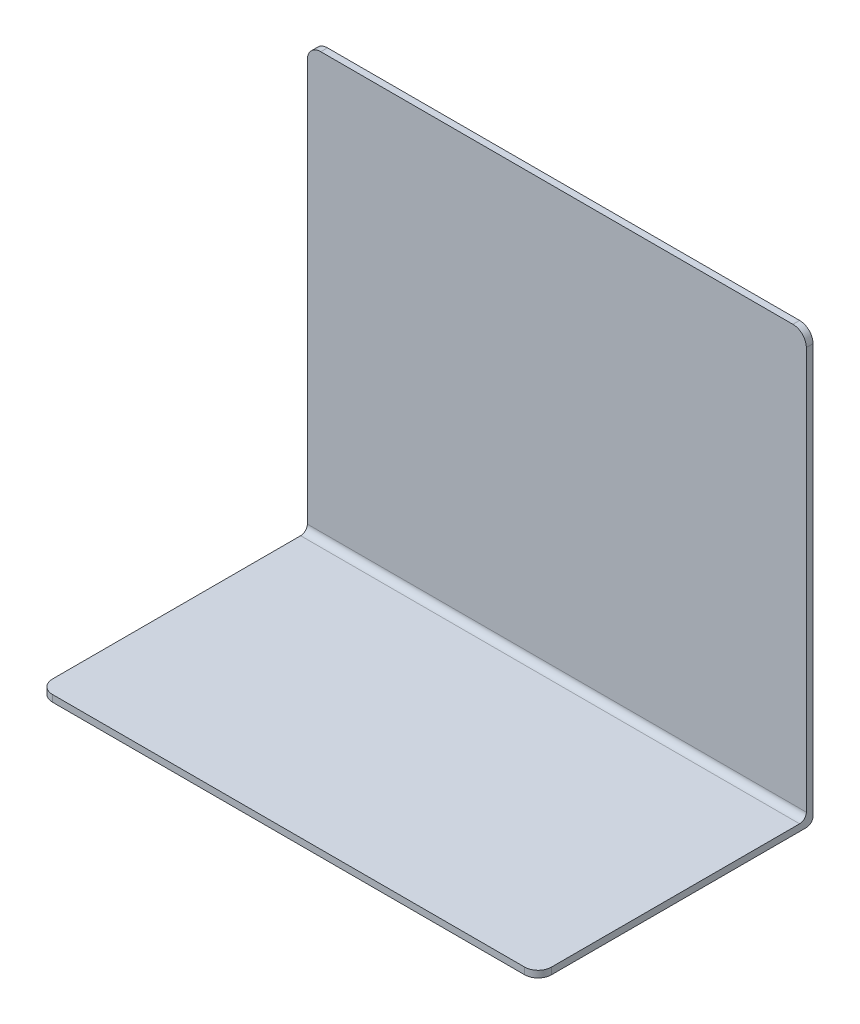
ISO-10303-21;
HEADER;
FILE_DESCRIPTION(('STEP AP214'),'2;1');
FILE_NAME('part.step','',(''),(''),'','','');
FILE_SCHEMA(('AUTOMOTIVE_DESIGN { 1 0 10303 214 1 1 1 1 }'));
ENDSEC;
DATA;
#1=APPLICATION_CONTEXT('core data for automotive mechanical design processes');
#2=APPLICATION_PROTOCOL_DEFINITION('international standard','automotive_design',2000,#1);
#3=PRODUCT_CONTEXT('',#1,'mechanical');
#4=PRODUCT('Part','Part','',(#3));
#5=PRODUCT_RELATED_PRODUCT_CATEGORY('part','',(#4));
#6=PRODUCT_DEFINITION_FORMATION('','',#4);
#7=PRODUCT_DEFINITION_CONTEXT('part definition',#1,'design');
#8=PRODUCT_DEFINITION('design','',#6,#7);
#9=PRODUCT_DEFINITION_SHAPE('','',#8);
#10=(LENGTH_UNIT() NAMED_UNIT(*) SI_UNIT(.MILLI.,.METRE.));
#11=(NAMED_UNIT(*) PLANE_ANGLE_UNIT() SI_UNIT($,.RADIAN.));
#12=(NAMED_UNIT(*) SI_UNIT($,.STERADIAN.) SOLID_ANGLE_UNIT());
#13=UNCERTAINTY_MEASURE_WITH_UNIT(LENGTH_MEASURE(1.E-05),#10,'distance_accuracy_value','');
#14=(GEOMETRIC_REPRESENTATION_CONTEXT(3) GLOBAL_UNCERTAINTY_ASSIGNED_CONTEXT((#13)) GLOBAL_UNIT_ASSIGNED_CONTEXT((#10,
#11,#12)) REPRESENTATION_CONTEXT('',''));
#15=CARTESIAN_POINT('',(0.,0.,0.));
#16=DIRECTION('',(0.,0.,1.));
#17=DIRECTION('',(1.,0.,0.));
#18=AXIS2_PLACEMENT_3D('',#15,#16,#17);
#19=CARTESIAN_POINT('',(0.,0.,3.175));
#20=DIRECTION('',(0.,0.,-1.));
#21=DIRECTION('',(-1.,0.,0.));
#22=AXIS2_PLACEMENT_3D('',#19,#20,#21);
#23=PLANE('',#22);
#24=DIRECTION('',(0.,1.,0.));
#25=VECTOR('',#24,1.);
#26=CARTESIAN_POINT('',(118.11,-101.6,3.175));
#27=LINE('',#26,#25);
#28=CARTESIAN_POINT('',(118.11,-95.25,3.175));
#29=VERTEX_POINT('',#28);
#30=CARTESIAN_POINT('',(118.11,95.25,3.175));
#31=VERTEX_POINT('',#30);
#32=EDGE_CURVE('E215',#29,#31,#27,.T.);
#33=ORIENTED_EDGE('',*,*,#32,.T.);
#34=CARTESIAN_POINT('',(111.76,95.25,3.175));
#35=DIRECTION('',(0.,0.,-1.));
#36=DIRECTION('',(-1.,0.,0.));
#37=AXIS2_PLACEMENT_3D('',#34,#35,#36);
#38=CIRCLE('',#37,6.35);
#39=CARTESIAN_POINT('',(111.76,101.6,3.175));
#40=VERTEX_POINT('',#39);
#41=EDGE_CURVE('E182',#31,#40,#38,.F.);
#42=ORIENTED_EDGE('',*,*,#41,.T.);
#43=DIRECTION('',(-1.,0.,0.));
#44=VECTOR('',#43,1.);
#45=CARTESIAN_POINT('',(-118.11,101.6,3.175));
#46=LINE('',#45,#44);
#47=CARTESIAN_POINT('',(-111.76,101.6,3.175));
#48=VERTEX_POINT('',#47);
#49=EDGE_CURVE('E218',#40,#48,#46,.T.);
#50=ORIENTED_EDGE('',*,*,#49,.T.);
#51=CARTESIAN_POINT('',(-111.76,95.25,3.175));
#52=DIRECTION('',(0.,0.,-1.));
#53=DIRECTION('',(-1.,0.,0.));
#54=AXIS2_PLACEMENT_3D('',#51,#52,#53);
#55=CIRCLE('',#54,6.35);
#56=CARTESIAN_POINT('',(-118.11,95.25,3.175));
#57=VERTEX_POINT('',#56);
#58=EDGE_CURVE('E180',#48,#57,#55,.F.);
#59=ORIENTED_EDGE('',*,*,#58,.T.);
#60=DIRECTION('',(0.,-1.,0.));
#61=VECTOR('',#60,1.);
#62=CARTESIAN_POINT('',(-118.11,-101.6,3.175));
#63=LINE('',#62,#61);
#64=CARTESIAN_POINT('',(-118.11,-95.25,3.175));
#65=VERTEX_POINT('',#64);
#66=EDGE_CURVE('E137',#57,#65,#63,.T.);
#67=ORIENTED_EDGE('',*,*,#66,.T.);
#68=DIRECTION('',(-1.,0.,0.));
#69=VECTOR('',#68,1.);
#70=CARTESIAN_POINT('',(118.11,-95.25,3.175));
#71=LINE('',#70,#69);
#72=EDGE_CURVE('E160',#65,#29,#71,.F.);
#73=ORIENTED_EDGE('',*,*,#72,.T.);
#74=EDGE_LOOP('',(#33,#42,#50,#59,#67,#73));
#75=FACE_BOUND('',#74,.T.);
#76=ADVANCED_FACE('F35',(#75),#23,.F.);
#77=CARTESIAN_POINT('',(118.11,-101.6,3.175));
#78=DIRECTION('',(-1.,0.,0.));
#79=DIRECTION('',(0.,0.,1.));
#80=AXIS2_PLACEMENT_3D('',#77,#78,#79);
#81=PLANE('',#80);
#82=DIRECTION('',(0.,1.,0.));
#83=VECTOR('',#82,1.);
#84=CARTESIAN_POINT('',(118.11,-101.6,0.));
#85=LINE('',#84,#83);
#86=CARTESIAN_POINT('',(118.11,-98.425,0.));
#87=VERTEX_POINT('',#86);
#88=CARTESIAN_POINT('',(118.11,95.25,0.));
#89=VERTEX_POINT('',#88);
#90=EDGE_CURVE('E214',#87,#89,#85,.T.);
#91=ORIENTED_EDGE('',*,*,#90,.T.);
#92=DIRECTION('',(0.,0.,-1.));
#93=VECTOR('',#92,1.);
#94=CARTESIAN_POINT('',(118.11,95.25,3.175));
#95=LINE('',#94,#93);
#96=EDGE_CURVE('E178',#89,#31,#95,.F.);
#97=ORIENTED_EDGE('',*,*,#96,.T.);
#98=ORIENTED_EDGE('',*,*,#32,.F.);
#99=CARTESIAN_POINT('',(118.11,-95.25,6.34999999999999));
#100=DIRECTION('',(-1.,0.,0.));
#101=DIRECTION('',(0.,0.,1.));
#102=AXIS2_PLACEMENT_3D('',#99,#100,#101);
#103=CIRCLE('',#102,3.175);
#104=CARTESIAN_POINT('',(118.11,-98.425,6.34999999999999));
#105=VERTEX_POINT('',#104);
#106=EDGE_CURVE('E165',#29,#105,#103,.T.);
#107=ORIENTED_EDGE('',*,*,#106,.T.);
#108=DIRECTION('',(0.,0.,-1.));
#109=VECTOR('',#108,1.);
#110=CARTESIAN_POINT('',(118.11,-98.425,130.175));
#111=LINE('',#110,#109);
#112=CARTESIAN_POINT('',(118.11,-98.425,123.825));
#113=VERTEX_POINT('',#112);
#114=EDGE_CURVE('E209',#113,#105,#111,.T.);
#115=ORIENTED_EDGE('',*,*,#114,.F.);
#116=DIRECTION('',(0.,1.,0.));
#117=VECTOR('',#116,1.);
#118=CARTESIAN_POINT('',(118.11,-101.6,123.825));
#119=LINE('',#118,#117);
#120=CARTESIAN_POINT('',(118.11,-101.6,123.825));
#121=VERTEX_POINT('',#120);
#122=EDGE_CURVE('E132',#113,#121,#119,.F.);
#123=ORIENTED_EDGE('',*,*,#122,.T.);
#124=DIRECTION('',(0.,0.,-1.));
#125=VECTOR('',#124,1.);
#126=CARTESIAN_POINT('',(118.11,-101.6,3.175));
#127=LINE('',#126,#125);
#128=CARTESIAN_POINT('',(118.11,-101.6,3.175));
#129=VERTEX_POINT('',#128);
#130=EDGE_CURVE('E125',#121,#129,#127,.T.);
#131=ORIENTED_EDGE('',*,*,#130,.T.);
#132=CARTESIAN_POINT('',(118.11,-98.425,3.175));
#133=DIRECTION('',(-1.,0.,0.));
#134=DIRECTION('',(0.,0.,1.));
#135=AXIS2_PLACEMENT_3D('',#132,#133,#134);
#136=CIRCLE('',#135,3.175);
#137=EDGE_CURVE('E129',#129,#87,#136,.F.);
#138=ORIENTED_EDGE('',*,*,#137,.T.);
#139=EDGE_LOOP('',(#91,#97,#98,#107,#115,#123,#131,#138));
#140=FACE_BOUND('',#139,.T.);
#141=ADVANCED_FACE('F128',(#140),#81,.F.);
#142=CARTESIAN_POINT('',(-118.11,101.6,3.175));
#143=DIRECTION('',(0.,-1.,0.));
#144=DIRECTION('',(0.,0.,-1.));
#145=AXIS2_PLACEMENT_3D('',#142,#143,#144);
#146=PLANE('',#145);
#147=ORIENTED_EDGE('',*,*,#49,.F.);
#148=DIRECTION('',(0.,0.,-1.));
#149=VECTOR('',#148,1.);
#150=CARTESIAN_POINT('',(111.76,101.6,3.175));
#151=LINE('',#150,#149);
#152=CARTESIAN_POINT('',(111.76,101.6,0.));
#153=VERTEX_POINT('',#152);
#154=EDGE_CURVE('E170',#40,#153,#151,.T.);
#155=ORIENTED_EDGE('',*,*,#154,.T.);
#156=DIRECTION('',(-1.,0.,0.));
#157=VECTOR('',#156,1.);
#158=CARTESIAN_POINT('',(-118.11,101.6,0.));
#159=LINE('',#158,#157);
#160=CARTESIAN_POINT('',(-111.76,101.6,0.));
#161=VERTEX_POINT('',#160);
#162=EDGE_CURVE('E224',#153,#161,#159,.T.);
#163=ORIENTED_EDGE('',*,*,#162,.T.);
#164=DIRECTION('',(0.,0.,-1.));
#165=VECTOR('',#164,1.);
#166=CARTESIAN_POINT('',(-111.76,101.6,3.175));
#167=LINE('',#166,#165);
#168=EDGE_CURVE('E168',#161,#48,#167,.F.);
#169=ORIENTED_EDGE('',*,*,#168,.T.);
#170=EDGE_LOOP('',(#147,#155,#163,#169));
#171=FACE_BOUND('',#170,.T.);
#172=ADVANCED_FACE('F242',(#171),#146,.F.);
#173=CARTESIAN_POINT('',(-118.11,-101.6,3.175));
#174=DIRECTION('',(1.,0.,0.));
#175=DIRECTION('',(0.,0.,-1.));
#176=AXIS2_PLACEMENT_3D('',#173,#174,#175);
#177=PLANE('',#176);
#178=ORIENTED_EDGE('',*,*,#66,.F.);
#179=DIRECTION('',(0.,0.,-1.));
#180=VECTOR('',#179,1.);
#181=CARTESIAN_POINT('',(-118.11,95.25,3.175));
#182=LINE('',#181,#180);
#183=CARTESIAN_POINT('',(-118.11,95.25,0.));
#184=VERTEX_POINT('',#183);
#185=EDGE_CURVE('E186',#57,#184,#182,.T.);
#186=ORIENTED_EDGE('',*,*,#185,.T.);
#187=DIRECTION('',(0.,-1.,0.));
#188=VECTOR('',#187,1.);
#189=CARTESIAN_POINT('',(-118.11,-101.6,0.));
#190=LINE('',#189,#188);
#191=CARTESIAN_POINT('',(-118.11,-98.425,0.));
#192=VERTEX_POINT('',#191);
#193=EDGE_CURVE('E219',#184,#192,#190,.T.);
#194=ORIENTED_EDGE('',*,*,#193,.T.);
#195=CARTESIAN_POINT('',(-118.11,-98.425,3.175));
#196=DIRECTION('',(1.,0.,0.));
#197=DIRECTION('',(0.,0.,-1.));
#198=AXIS2_PLACEMENT_3D('',#195,#196,#197);
#199=CIRCLE('',#198,3.175);
#200=CARTESIAN_POINT('',(-118.11,-101.6,3.175));
#201=VERTEX_POINT('',#200);
#202=EDGE_CURVE('E155',#192,#201,#199,.F.);
#203=ORIENTED_EDGE('',*,*,#202,.T.);
#204=DIRECTION('',(0.,0.,-1.));
#205=VECTOR('',#204,1.);
#206=CARTESIAN_POINT('',(-118.11,-101.6,3.175));
#207=LINE('',#206,#205);
#208=CARTESIAN_POINT('',(-118.11,-101.6,123.825));
#209=VERTEX_POINT('',#208);
#210=EDGE_CURVE('E136',#209,#201,#207,.T.);
#211=ORIENTED_EDGE('',*,*,#210,.F.);
#212=DIRECTION('',(0.,-1.,0.));
#213=VECTOR('',#212,1.);
#214=CARTESIAN_POINT('',(-118.11,-101.6,123.825));
#215=LINE('',#214,#213);
#216=CARTESIAN_POINT('',(-118.11,-98.425,123.825));
#217=VERTEX_POINT('',#216);
#218=EDGE_CURVE('E184',#209,#217,#215,.F.);
#219=ORIENTED_EDGE('',*,*,#218,.T.);
#220=DIRECTION('',(0.,0.,-1.));
#221=VECTOR('',#220,1.);
#222=CARTESIAN_POINT('',(-118.11,-98.425,130.175));
#223=LINE('',#222,#221);
#224=CARTESIAN_POINT('',(-118.11,-98.425,6.34999999999999));
#225=VERTEX_POINT('',#224);
#226=EDGE_CURVE('E207',#217,#225,#223,.T.);
#227=ORIENTED_EDGE('',*,*,#226,.T.);
#228=CARTESIAN_POINT('',(-118.11,-95.25,6.34999999999999));
#229=DIRECTION('',(1.,0.,0.));
#230=DIRECTION('',(0.,0.,-1.));
#231=AXIS2_PLACEMENT_3D('',#228,#229,#230);
#232=CIRCLE('',#231,3.175);
#233=EDGE_CURVE('E162',#225,#65,#232,.T.);
#234=ORIENTED_EDGE('',*,*,#233,.T.);
#235=EDGE_LOOP('',(#178,#186,#194,#203,#211,#219,#227,#234));
#236=FACE_BOUND('',#235,.T.);
#237=ADVANCED_FACE('F203',(#236),#177,.F.);
#238=CARTESIAN_POINT('',(-118.11,-101.6,3.175));
#239=DIRECTION('',(0.,1.,0.));
#240=DIRECTION('',(0.,0.,1.));
#241=AXIS2_PLACEMENT_3D('',#238,#239,#240);
#242=PLANE('',#241);
#243=ORIENTED_EDGE('',*,*,#130,.F.);
#244=CARTESIAN_POINT('',(111.76,-101.6,123.825));
#245=DIRECTION('',(0.,1.,0.));
#246=DIRECTION('',(0.,0.,1.));
#247=AXIS2_PLACEMENT_3D('',#244,#245,#246);
#248=CIRCLE('',#247,6.35);
#249=CARTESIAN_POINT('',(111.76,-101.6,130.175));
#250=VERTEX_POINT('',#249);
#251=EDGE_CURVE('E11',#121,#250,#248,.F.);
#252=ORIENTED_EDGE('',*,*,#251,.T.);
#253=DIRECTION('',(1.,0.,0.));
#254=VECTOR('',#253,1.);
#255=CARTESIAN_POINT('',(-118.11,-101.6,130.175));
#256=LINE('',#255,#254);
#257=CARTESIAN_POINT('',(-111.76,-101.6,130.175));
#258=VERTEX_POINT('',#257);
#259=EDGE_CURVE('E197',#258,#250,#256,.T.);
#260=ORIENTED_EDGE('',*,*,#259,.F.);
#261=CARTESIAN_POINT('',(-111.76,-101.6,123.825));
#262=DIRECTION('',(0.,1.,0.));
#263=DIRECTION('',(0.,0.,1.));
#264=AXIS2_PLACEMENT_3D('',#261,#262,#263);
#265=CIRCLE('',#264,6.35);
#266=EDGE_CURVE('E43',#258,#209,#265,.F.);
#267=ORIENTED_EDGE('',*,*,#266,.T.);
#268=ORIENTED_EDGE('',*,*,#210,.T.);
#269=DIRECTION('',(1.,0.,0.));
#270=VECTOR('',#269,1.);
#271=CARTESIAN_POINT('',(118.11,-101.6,3.175));
#272=LINE('',#271,#270);
#273=EDGE_CURVE('E144',#201,#129,#272,.T.);
#274=ORIENTED_EDGE('',*,*,#273,.T.);
#275=EDGE_LOOP('',(#243,#252,#260,#267,#268,#274));
#276=FACE_BOUND('',#275,.T.);
#277=ADVANCED_FACE('F148',(#276),#242,.F.);
#278=CARTESIAN_POINT('',(0.,0.,0.));
#279=DIRECTION('',(0.,0.,-1.));
#280=DIRECTION('',(-1.,0.,0.));
#281=AXIS2_PLACEMENT_3D('',#278,#279,#280);
#282=PLANE('',#281);
#283=ORIENTED_EDGE('',*,*,#162,.F.);
#284=CARTESIAN_POINT('',(111.76,95.25,0.));
#285=DIRECTION('',(0.,0.,-1.));
#286=DIRECTION('',(-1.,0.,0.));
#287=AXIS2_PLACEMENT_3D('',#284,#285,#286);
#288=CIRCLE('',#287,6.35);
#289=EDGE_CURVE('E175',#153,#89,#288,.T.);
#290=ORIENTED_EDGE('',*,*,#289,.T.);
#291=ORIENTED_EDGE('',*,*,#90,.F.);
#292=DIRECTION('',(1.,0.,0.));
#293=VECTOR('',#292,1.);
#294=CARTESIAN_POINT('',(-118.11,-98.425,0.));
#295=LINE('',#294,#293);
#296=EDGE_CURVE('E146',#87,#192,#295,.F.);
#297=ORIENTED_EDGE('',*,*,#296,.T.);
#298=ORIENTED_EDGE('',*,*,#193,.F.);
#299=CARTESIAN_POINT('',(-111.76,95.25,0.));
#300=DIRECTION('',(0.,0.,-1.));
#301=DIRECTION('',(-1.,0.,0.));
#302=AXIS2_PLACEMENT_3D('',#299,#300,#301);
#303=CIRCLE('',#302,6.35);
#304=EDGE_CURVE('E173',#184,#161,#303,.T.);
#305=ORIENTED_EDGE('',*,*,#304,.T.);
#306=EDGE_LOOP('',(#283,#290,#291,#297,#298,#305));
#307=FACE_BOUND('',#306,.T.);
#308=ADVANCED_FACE('F231',(#307),#282,.T.);
#309=CARTESIAN_POINT('',(-118.11,-98.425,130.175));
#310=DIRECTION('',(0.,-1.,0.));
#311=DIRECTION('',(0.,0.,-1.));
#312=AXIS2_PLACEMENT_3D('',#309,#310,#311);
#313=PLANE('',#312);
#314=DIRECTION('',(-1.,0.,0.));
#315=VECTOR('',#314,1.);
#316=CARTESIAN_POINT('',(-118.11,-98.425,130.175));
#317=LINE('',#316,#315);
#318=CARTESIAN_POINT('',(111.76,-98.425,130.175));
#319=VERTEX_POINT('',#318);
#320=CARTESIAN_POINT('',(-111.76,-98.425,130.175));
#321=VERTEX_POINT('',#320);
#322=EDGE_CURVE('E206',#319,#321,#317,.T.);
#323=ORIENTED_EDGE('',*,*,#322,.F.);
#324=CARTESIAN_POINT('',(111.76,-98.425,123.825));
#325=DIRECTION('',(0.,-1.,0.));
#326=DIRECTION('',(0.,0.,-1.));
#327=AXIS2_PLACEMENT_3D('',#324,#325,#326);
#328=CIRCLE('',#327,6.35);
#329=EDGE_CURVE('E58',#319,#113,#328,.F.);
#330=ORIENTED_EDGE('',*,*,#329,.T.);
#331=ORIENTED_EDGE('',*,*,#114,.T.);
#332=DIRECTION('',(-1.,0.,0.));
#333=VECTOR('',#332,1.);
#334=CARTESIAN_POINT('',(-118.11,-98.425,6.34999999999999));
#335=LINE('',#334,#333);
#336=EDGE_CURVE('E157',#105,#225,#335,.T.);
#337=ORIENTED_EDGE('',*,*,#336,.T.);
#338=ORIENTED_EDGE('',*,*,#226,.F.);
#339=CARTESIAN_POINT('',(-111.76,-98.425,123.825));
#340=DIRECTION('',(0.,-1.,0.));
#341=DIRECTION('',(0.,0.,-1.));
#342=AXIS2_PLACEMENT_3D('',#339,#340,#341);
#343=CIRCLE('',#342,6.35);
#344=EDGE_CURVE('E50',#217,#321,#343,.F.);
#345=ORIENTED_EDGE('',*,*,#344,.T.);
#346=EDGE_LOOP('',(#323,#330,#331,#337,#338,#345));
#347=FACE_BOUND('',#346,.T.);
#348=ADVANCED_FACE('F252',(#347),#313,.F.);
#349=CARTESIAN_POINT('',(0.,0.,130.175));
#350=DIRECTION('',(0.,0.,-1.));
#351=DIRECTION('',(-1.,0.,0.));
#352=AXIS2_PLACEMENT_3D('',#349,#350,#351);
#353=PLANE('',#352);
#354=ORIENTED_EDGE('',*,*,#259,.T.);
#355=DIRECTION('',(0.,1.,0.));
#356=VECTOR('',#355,1.);
#357=CARTESIAN_POINT('',(111.76,0.,130.175));
#358=LINE('',#357,#356);
#359=EDGE_CURVE('E192',#250,#319,#358,.T.);
#360=ORIENTED_EDGE('',*,*,#359,.T.);
#361=ORIENTED_EDGE('',*,*,#322,.T.);
#362=DIRECTION('',(0.,-1.,0.));
#363=VECTOR('',#362,1.);
#364=CARTESIAN_POINT('',(-111.76,0.,130.175));
#365=LINE('',#364,#363);
#366=EDGE_CURVE('E189',#321,#258,#365,.T.);
#367=ORIENTED_EDGE('',*,*,#366,.T.);
#368=EDGE_LOOP('',(#354,#360,#361,#367));
#369=FACE_BOUND('',#368,.T.);
#370=ADVANCED_FACE('F205',(#369),#353,.F.);
#371=CARTESIAN_POINT('',(-118.11,-98.425,3.175));
#372=DIRECTION('',(-1.,0.,0.));
#373=DIRECTION('',(0.,0.,1.));
#374=AXIS2_PLACEMENT_3D('',#371,#372,#373);
#375=CYLINDRICAL_SURFACE('',#374,3.175);
#376=ORIENTED_EDGE('',*,*,#202,.F.);
#377=ORIENTED_EDGE('',*,*,#296,.F.);
#378=ORIENTED_EDGE('',*,*,#137,.F.);
#379=ORIENTED_EDGE('',*,*,#273,.F.);
#380=EDGE_LOOP('',(#376,#377,#378,#379));
#381=FACE_BOUND('',#380,.T.);
#382=ADVANCED_FACE('F143',(#381),#375,.T.);
#383=CARTESIAN_POINT('',(-118.11,-95.25,6.34999999999999));
#384=DIRECTION('',(1.,0.,0.));
#385=DIRECTION('',(0.,0.,-1.));
#386=AXIS2_PLACEMENT_3D('',#383,#384,#385);
#387=CYLINDRICAL_SURFACE('',#386,3.175);
#388=ORIENTED_EDGE('',*,*,#106,.F.);
#389=ORIENTED_EDGE('',*,*,#72,.F.);
#390=ORIENTED_EDGE('',*,*,#233,.F.);
#391=ORIENTED_EDGE('',*,*,#336,.F.);
#392=EDGE_LOOP('',(#388,#389,#390,#391));
#393=FACE_BOUND('',#392,.T.);
#394=ADVANCED_FACE('F251',(#393),#387,.F.);
#395=CARTESIAN_POINT('',(111.76,95.25,3.175));
#396=DIRECTION('',(0.,0.,-1.));
#397=DIRECTION('',(-1.,0.,0.));
#398=AXIS2_PLACEMENT_3D('',#395,#396,#397);
#399=CYLINDRICAL_SURFACE('',#398,6.35);
#400=ORIENTED_EDGE('',*,*,#41,.F.);
#401=ORIENTED_EDGE('',*,*,#96,.F.);
#402=ORIENTED_EDGE('',*,*,#289,.F.);
#403=ORIENTED_EDGE('',*,*,#154,.F.);
#404=EDGE_LOOP('',(#400,#401,#402,#403));
#405=FACE_BOUND('',#404,.T.);
#406=ADVANCED_FACE('F236',(#405),#399,.T.);
#407=CARTESIAN_POINT('',(-111.76,95.25,3.175));
#408=DIRECTION('',(0.,0.,-1.));
#409=DIRECTION('',(-1.,0.,0.));
#410=AXIS2_PLACEMENT_3D('',#407,#408,#409);
#411=CYLINDRICAL_SURFACE('',#410,6.35);
#412=ORIENTED_EDGE('',*,*,#58,.F.);
#413=ORIENTED_EDGE('',*,*,#168,.F.);
#414=ORIENTED_EDGE('',*,*,#304,.F.);
#415=ORIENTED_EDGE('',*,*,#185,.F.);
#416=EDGE_LOOP('',(#412,#413,#414,#415));
#417=FACE_BOUND('',#416,.T.);
#418=ADVANCED_FACE('F245',(#417),#411,.T.);
#419=CARTESIAN_POINT('',(111.76,0.,123.825));
#420=DIRECTION('',(0.,1.,0.));
#421=DIRECTION('',(0.,0.,1.));
#422=AXIS2_PLACEMENT_3D('',#419,#420,#421);
#423=CYLINDRICAL_SURFACE('',#422,6.35);
#424=ORIENTED_EDGE('',*,*,#251,.F.);
#425=ORIENTED_EDGE('',*,*,#122,.F.);
#426=ORIENTED_EDGE('',*,*,#329,.F.);
#427=ORIENTED_EDGE('',*,*,#359,.F.);
#428=EDGE_LOOP('',(#424,#425,#426,#427));
#429=FACE_BOUND('',#428,.T.);
#430=ADVANCED_FACE('F281',(#429),#423,.T.);
#431=CARTESIAN_POINT('',(-111.76,0.,123.825));
#432=DIRECTION('',(0.,-1.,0.));
#433=DIRECTION('',(0.,0.,-1.));
#434=AXIS2_PLACEMENT_3D('',#431,#432,#433);
#435=CYLINDRICAL_SURFACE('',#434,6.35);
#436=ORIENTED_EDGE('',*,*,#344,.F.);
#437=ORIENTED_EDGE('',*,*,#218,.F.);
#438=ORIENTED_EDGE('',*,*,#266,.F.);
#439=ORIENTED_EDGE('',*,*,#366,.F.);
#440=EDGE_LOOP('',(#436,#437,#438,#439));
#441=FACE_BOUND('',#440,.T.);
#442=ADVANCED_FACE('F37',(#441),#435,.T.);
#443=CLOSED_SHELL('',(#76,#141,#172,#237,#277,#308,#348,#370,#382,#394,#406,#418,#430,#442));
#444=MANIFOLD_SOLID_BREP('B2',#443);
#445=ADVANCED_BREP_SHAPE_REPRESENTATION('',(#18,#444),#14);
#446=SHAPE_DEFINITION_REPRESENTATION(#9,#445);
ENDSEC;
END-ISO-10303-21;
